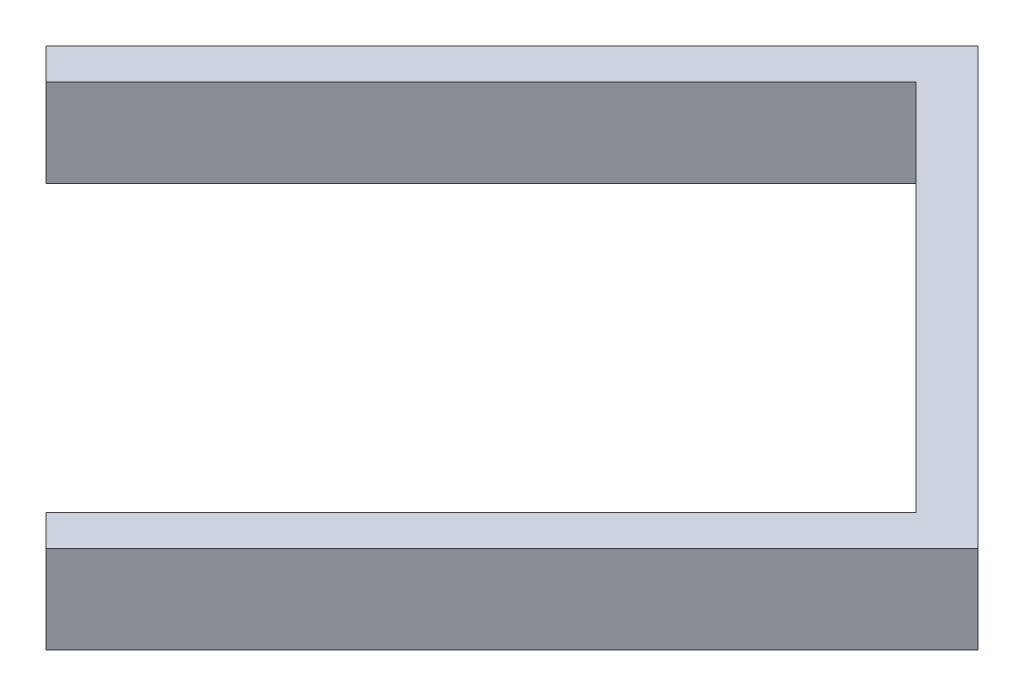
ISO-10303-21;
HEADER;
FILE_DESCRIPTION(('STEP AP214'),'2;1');
FILE_NAME('part.step','',(''),(''),'','','');
FILE_SCHEMA(('AUTOMOTIVE_DESIGN { 1 0 10303 214 1 1 1 1 }'));
ENDSEC;
DATA;
#1=APPLICATION_CONTEXT('core data for automotive mechanical design processes');
#2=APPLICATION_PROTOCOL_DEFINITION('international standard','automotive_design',2000,#1);
#3=PRODUCT_CONTEXT('',#1,'mechanical');
#4=PRODUCT('Part','Part','',(#3));
#5=PRODUCT_RELATED_PRODUCT_CATEGORY('part','',(#4));
#6=PRODUCT_DEFINITION_FORMATION('','',#4);
#7=PRODUCT_DEFINITION_CONTEXT('part definition',#1,'design');
#8=PRODUCT_DEFINITION('design','',#6,#7);
#9=PRODUCT_DEFINITION_SHAPE('','',#8);
#10=(LENGTH_UNIT() NAMED_UNIT(*) SI_UNIT(.MILLI.,.METRE.));
#11=(NAMED_UNIT(*) PLANE_ANGLE_UNIT() SI_UNIT($,.RADIAN.));
#12=(NAMED_UNIT(*) SI_UNIT($,.STERADIAN.) SOLID_ANGLE_UNIT());
#13=UNCERTAINTY_MEASURE_WITH_UNIT(LENGTH_MEASURE(1.E-05),#10,'distance_accuracy_value','');
#14=(GEOMETRIC_REPRESENTATION_CONTEXT(3) GLOBAL_UNCERTAINTY_ASSIGNED_CONTEXT((#13)) GLOBAL_UNIT_ASSIGNED_CONTEXT((#10,
#11,#12)) REPRESENTATION_CONTEXT('',''));
#15=CARTESIAN_POINT('',(0.,0.,0.));
#16=DIRECTION('',(0.,0.,1.));
#17=DIRECTION('',(1.,0.,0.));
#18=AXIS2_PLACEMENT_3D('',#15,#16,#17);
#19=CARTESIAN_POINT('',(-108.053527883218,50.8,-108.053527883218));
#20=DIRECTION('',(0.707106781186548,0.,0.707106781186547));
#21=DIRECTION('',(0.707106781186547,0.,-0.707106781186548));
#22=AXIS2_PLACEMENT_3D('',#19,#20,#21);
#23=PLANE('',#22);
#24=DIRECTION('',(-0.707106781186547,0.,0.707106781186548));
#25=VECTOR('',#24,1.);
#26=CARTESIAN_POINT('',(-108.053527883218,0.,-108.053527883218));
#27=LINE('',#26,#25);
#28=CARTESIAN_POINT('',(11.3038915641731,0.,-227.410947330609));
#29=VERTEX_POINT('',#28);
#30=CARTESIAN_POINT('',(-240.143279825763,0.,24.0362240593278));
#31=VERTEX_POINT('',#30);
#32=EDGE_CURVE('E142',#29,#31,#27,.T.);
#33=ORIENTED_EDGE('',*,*,#32,.F.);
#34=DIRECTION('',(0.,-1.,0.));
#35=VECTOR('',#34,1.);
#36=CARTESIAN_POINT('',(11.3038915641731,50.8,-227.410947330609));
#37=LINE('',#36,#35);
#38=CARTESIAN_POINT('',(11.3038915641731,50.8,-227.410947330609));
#39=VERTEX_POINT('',#38);
#40=EDGE_CURVE('E11',#39,#29,#37,.T.);
#41=ORIENTED_EDGE('',*,*,#40,.F.);
#42=DIRECTION('',(-0.707106781186547,0.,0.707106781186548));
#43=VECTOR('',#42,1.);
#44=CARTESIAN_POINT('',(-108.053527883218,50.8,-108.053527883218));
#45=LINE('',#44,#43);
#46=CARTESIAN_POINT('',(-240.143279825763,50.8,24.0362240593278));
#47=VERTEX_POINT('',#46);
#48=EDGE_CURVE('E171',#39,#47,#45,.T.);
#49=ORIENTED_EDGE('',*,*,#48,.T.);
#50=DIRECTION('',(0.,-1.,0.));
#51=VECTOR('',#50,1.);
#52=CARTESIAN_POINT('',(-240.143279825763,50.8,24.0362240593278));
#53=LINE('',#52,#51);
#54=EDGE_CURVE('E61',#47,#31,#53,.T.);
#55=ORIENTED_EDGE('',*,*,#54,.T.);
#56=EDGE_LOOP('',(#33,#41,#49,#55));
#57=FACE_BOUND('',#56,.T.);
#58=ADVANCED_FACE('F44',(#57),#23,.T.);
#59=CARTESIAN_POINT('',(119.357419447391,50.8,-119.357419447391));
#60=DIRECTION('',(-0.707106781186547,0.,0.707106781186548));
#61=DIRECTION('',(0.707106781186548,0.,0.707106781186547));
#62=AXIS2_PLACEMENT_3D('',#59,#60,#61);
#63=PLANE('',#62);
#64=CARTESIAN_POINT('',(119.357419447391,25.4,-119.357419447391));
#65=DIRECTION('',(-0.707106781186547,0.,0.707106781186548));
#66=DIRECTION('',(0.707106781186548,0.,0.707106781186547));
#67=AXIS2_PLACEMENT_3D('',#64,#65,#66);
#68=CIRCLE('',#67,6.35000000000003);
#69=CARTESIAN_POINT('',(114.867291386856,25.4,-123.847547507925));
#70=VERTEX_POINT('',#69);
#71=EDGE_CURVE('E146',#70,#70,#68,.T.);
#72=ORIENTED_EDGE('',*,*,#71,.F.);
#73=EDGE_LOOP('',(#72));
#74=FACE_BOUND('',#73,.T.);
#75=DIRECTION('',(-0.707106781186548,0.,-0.707106781186547));
#76=VECTOR('',#75,1.);
#77=CARTESIAN_POINT('',(119.357419447391,0.,-119.357419447391));
#78=LINE('',#77,#76);
#79=CARTESIAN_POINT('',(226.830038469833,0.,-11.884800424949));
#80=VERTEX_POINT('',#79);
#81=EDGE_CURVE('E145',#80,#29,#78,.T.);
#82=ORIENTED_EDGE('',*,*,#81,.F.);
#83=DIRECTION('',(0.,-1.,0.));
#84=VECTOR('',#83,1.);
#85=CARTESIAN_POINT('',(226.830038469833,50.8,-11.884800424949));
#86=LINE('',#85,#84);
#87=CARTESIAN_POINT('',(226.830038469833,50.8,-11.884800424949));
#88=VERTEX_POINT('',#87);
#89=EDGE_CURVE('E53',#88,#80,#86,.T.);
#90=ORIENTED_EDGE('',*,*,#89,.F.);
#91=DIRECTION('',(-0.707106781186548,0.,-0.707106781186547));
#92=VECTOR('',#91,1.);
#93=CARTESIAN_POINT('',(119.357419447391,50.8,-119.357419447391));
#94=LINE('',#93,#92);
#95=EDGE_CURVE('E203',#88,#39,#94,.T.);
#96=ORIENTED_EDGE('',*,*,#95,.T.);
#97=ORIENTED_EDGE('',*,*,#40,.T.);
#98=EDGE_LOOP('',(#82,#90,#96,#97));
#99=FACE_BOUND('',#98,.T.);
#100=ADVANCED_FACE('F194',(#74,#99),#63,.T.);
#101=CARTESIAN_POINT('',(107.472619022442,50.8,107.472619022442));
#102=DIRECTION('',(-0.707106781186547,0.,-0.707106781186548));
#103=DIRECTION('',(-0.707106781186548,0.,0.707106781186547));
#104=AXIS2_PLACEMENT_3D('',#101,#102,#103);
#105=PLANE('',#104);
#106=DIRECTION('',(0.707106781186548,0.,-0.707106781186547));
#107=VECTOR('',#106,1.);
#108=CARTESIAN_POINT('',(107.472619022442,0.,107.472619022442));
#109=LINE('',#108,#107);
#110=CARTESIAN_POINT('',(-24.6171329201035,0.,239.562370964987));
#111=VERTEX_POINT('',#110);
#112=EDGE_CURVE('E150',#111,#80,#109,.T.);
#113=ORIENTED_EDGE('',*,*,#112,.F.);
#114=DIRECTION('',(0.,-1.,0.));
#115=VECTOR('',#114,1.);
#116=CARTESIAN_POINT('',(-24.6171329201035,50.8,239.562370964987));
#117=LINE('',#116,#115);
#118=CARTESIAN_POINT('',(-24.6171329201035,50.8,239.562370964987));
#119=VERTEX_POINT('',#118);
#120=EDGE_CURVE('E181',#119,#111,#117,.T.);
#121=ORIENTED_EDGE('',*,*,#120,.F.);
#122=DIRECTION('',(0.707106781186548,0.,-0.707106781186547));
#123=VECTOR('',#122,1.);
#124=CARTESIAN_POINT('',(107.472619022442,50.8,107.472619022442));
#125=LINE('',#124,#123);
#126=EDGE_CURVE('E190',#119,#88,#125,.T.);
#127=ORIENTED_EDGE('',*,*,#126,.T.);
#128=ORIENTED_EDGE('',*,*,#89,.T.);
#129=EDGE_LOOP('',(#113,#121,#127,#128));
#130=FACE_BOUND('',#129,.T.);
#131=ADVANCED_FACE('F188',(#130),#105,.T.);
#132=CARTESIAN_POINT('',(-132.089751942545,50.8,132.089751942545));
#133=DIRECTION('',(-0.707106781186548,0.,0.707106781186548));
#134=DIRECTION('',(0.707106781186548,0.,0.707106781186548));
#135=AXIS2_PLACEMENT_3D('',#132,#133,#134);
#136=PLANE('',#135);
#137=DIRECTION('',(-0.707106781186548,0.,-0.707106781186548));
#138=VECTOR('',#137,1.);
#139=CARTESIAN_POINT('',(-132.089751942545,0.,132.089751942545));
#140=LINE('',#139,#138);
#141=CARTESIAN_POINT('',(-6.65662067796521,0.,257.522883207125));
#142=VERTEX_POINT('',#141);
#143=EDGE_CURVE('E154',#142,#111,#140,.T.);
#144=ORIENTED_EDGE('',*,*,#143,.F.);
#145=DIRECTION('',(0.,-1.,0.));
#146=VECTOR('',#145,1.);
#147=CARTESIAN_POINT('',(-6.65662067796521,50.8,257.522883207125));
#148=LINE('',#147,#146);
#149=CARTESIAN_POINT('',(-6.65662067796521,50.8,257.522883207125));
#150=VERTEX_POINT('',#149);
#151=EDGE_CURVE('E178',#150,#142,#148,.T.);
#152=ORIENTED_EDGE('',*,*,#151,.F.);
#153=DIRECTION('',(-0.707106781186548,0.,-0.707106781186548));
#154=VECTOR('',#153,1.);
#155=CARTESIAN_POINT('',(-132.089751942545,50.8,132.089751942545));
#156=LINE('',#155,#154);
#157=EDGE_CURVE('E202',#150,#119,#156,.T.);
#158=ORIENTED_EDGE('',*,*,#157,.T.);
#159=ORIENTED_EDGE('',*,*,#120,.T.);
#160=EDGE_LOOP('',(#144,#152,#158,#159));
#161=FACE_BOUND('',#160,.T.);
#162=ADVANCED_FACE('F200',(#161),#136,.T.);
#163=CARTESIAN_POINT('',(125.43313126458,50.8,125.43313126458));
#164=DIRECTION('',(0.707106781186548,0.,0.707106781186548));
#165=DIRECTION('',(0.707106781186548,0.,-0.707106781186548));
#166=AXIS2_PLACEMENT_3D('',#163,#164,#165);
#167=PLANE('',#166);
#168=DIRECTION('',(-0.707106781186548,0.,0.707106781186548));
#169=VECTOR('',#168,1.);
#170=CARTESIAN_POINT('',(125.43313126458,0.,125.43313126458));
#171=LINE('',#170,#169);
#172=CARTESIAN_POINT('',(262.751062954109,0.,-11.8848004249491));
#173=VERTEX_POINT('',#172);
#174=EDGE_CURVE('E158',#173,#142,#171,.T.);
#175=ORIENTED_EDGE('',*,*,#174,.F.);
#176=DIRECTION('',(0.,-1.,0.));
#177=VECTOR('',#176,1.);
#178=CARTESIAN_POINT('',(262.751062954109,50.8,-11.8848004249491));
#179=LINE('',#178,#177);
#180=CARTESIAN_POINT('',(262.751062954109,50.8,-11.8848004249491));
#181=VERTEX_POINT('',#180);
#182=EDGE_CURVE('E121',#181,#173,#179,.T.);
#183=ORIENTED_EDGE('',*,*,#182,.F.);
#184=DIRECTION('',(-0.707106781186548,0.,0.707106781186548));
#185=VECTOR('',#184,1.);
#186=CARTESIAN_POINT('',(125.43313126458,50.8,125.43313126458));
#187=LINE('',#186,#185);
#188=EDGE_CURVE('E131',#181,#150,#187,.T.);
#189=ORIENTED_EDGE('',*,*,#188,.T.);
#190=ORIENTED_EDGE('',*,*,#151,.T.);
#191=EDGE_LOOP('',(#175,#183,#189,#190));
#192=FACE_BOUND('',#191,.T.);
#193=ADVANCED_FACE('F213',(#192),#167,.T.);
#194=CARTESIAN_POINT('',(137.317931689529,50.8,-137.317931689529));
#195=DIRECTION('',(0.707106781186548,0.,-0.707106781186548));
#196=DIRECTION('',(-0.707106781186548,0.,-0.707106781186548));
#197=AXIS2_PLACEMENT_3D('',#194,#195,#196);
#198=PLANE('',#197);
#199=CARTESIAN_POINT('',(137.317931689529,25.4,-137.317931689529));
#200=DIRECTION('',(0.707106781186548,0.,-0.707106781186547));
#201=DIRECTION('',(-0.707106781186547,0.,-0.707106781186548));
#202=AXIS2_PLACEMENT_3D('',#199,#200,#201);
#203=CIRCLE('',#202,6.35000000000003);
#204=CARTESIAN_POINT('',(132.827803628995,25.4,-141.808059750064));
#205=VERTEX_POINT('',#204);
#206=EDGE_CURVE('E247',#205,#205,#203,.T.);
#207=ORIENTED_EDGE('',*,*,#206,.F.);
#208=EDGE_LOOP('',(#207));
#209=FACE_BOUND('',#208,.T.);
#210=DIRECTION('',(0.707106781186548,0.,0.707106781186548));
#211=VECTOR('',#210,1.);
#212=CARTESIAN_POINT('',(137.317931689529,0.,-137.317931689529));
#213=LINE('',#212,#211);
#214=CARTESIAN_POINT('',(11.303891564173,0.,-263.331971814885));
#215=VERTEX_POINT('',#214);
#216=EDGE_CURVE('E116',#215,#173,#213,.T.);
#217=ORIENTED_EDGE('',*,*,#216,.F.);
#218=DIRECTION('',(0.,-1.,0.));
#219=VECTOR('',#218,1.);
#220=CARTESIAN_POINT('',(11.303891564173,50.8,-263.331971814885));
#221=LINE('',#220,#219);
#222=CARTESIAN_POINT('',(11.303891564173,50.8,-263.331971814885));
#223=VERTEX_POINT('',#222);
#224=EDGE_CURVE('E111',#223,#215,#221,.T.);
#225=ORIENTED_EDGE('',*,*,#224,.F.);
#226=DIRECTION('',(0.707106781186548,0.,0.707106781186548));
#227=VECTOR('',#226,1.);
#228=CARTESIAN_POINT('',(137.317931689529,50.8,-137.317931689529));
#229=LINE('',#228,#227);
#230=EDGE_CURVE('E114',#223,#181,#229,.T.);
#231=ORIENTED_EDGE('',*,*,#230,.T.);
#232=ORIENTED_EDGE('',*,*,#182,.T.);
#233=EDGE_LOOP('',(#217,#225,#231,#232));
#234=FACE_BOUND('',#233,.T.);
#235=ADVANCED_FACE('F113',(#209,#234),#198,.T.);
#236=CARTESIAN_POINT('',(-126.014040125356,50.8,-126.014040125356));
#237=DIRECTION('',(-0.707106781186548,0.,-0.707106781186547));
#238=DIRECTION('',(-0.707106781186547,0.,0.707106781186548));
#239=AXIS2_PLACEMENT_3D('',#236,#237,#238);
#240=PLANE('',#239);
#241=DIRECTION('',(0.707106781186547,0.,-0.707106781186548));
#242=VECTOR('',#241,1.);
#243=CARTESIAN_POINT('',(-126.014040125356,0.,-126.014040125356));
#244=LINE('',#243,#242);
#245=CARTESIAN_POINT('',(-258.103792067901,0.,6.07571181718949));
#246=VERTEX_POINT('',#245);
#247=EDGE_CURVE('E164',#246,#215,#244,.T.);
#248=ORIENTED_EDGE('',*,*,#247,.F.);
#249=DIRECTION('',(0.,-1.,0.));
#250=VECTOR('',#249,1.);
#251=CARTESIAN_POINT('',(-258.103792067901,50.8,6.07571181718949));
#252=LINE('',#251,#250);
#253=CARTESIAN_POINT('',(-258.103792067901,50.8,6.07571181718949));
#254=VERTEX_POINT('',#253);
#255=EDGE_CURVE('E86',#254,#246,#252,.T.);
#256=ORIENTED_EDGE('',*,*,#255,.F.);
#257=DIRECTION('',(0.707106781186547,0.,-0.707106781186548));
#258=VECTOR('',#257,1.);
#259=CARTESIAN_POINT('',(-126.014040125356,50.8,-126.014040125356));
#260=LINE('',#259,#258);
#261=EDGE_CURVE('E128',#254,#223,#260,.T.);
#262=ORIENTED_EDGE('',*,*,#261,.T.);
#263=ORIENTED_EDGE('',*,*,#224,.T.);
#264=EDGE_LOOP('',(#248,#256,#262,#263));
#265=FACE_BOUND('',#264,.T.);
#266=ADVANCED_FACE('F134',(#265),#240,.T.);
#267=CARTESIAN_POINT('',(-132.089751942545,50.8,132.089751942545));
#268=DIRECTION('',(-0.707106781186548,0.,0.707106781186548));
#269=DIRECTION('',(0.707106781186548,0.,0.707106781186548));
#270=AXIS2_PLACEMENT_3D('',#267,#268,#269);
#271=PLANE('',#270);
#272=DIRECTION('',(-0.707106781186548,0.,-0.707106781186548));
#273=VECTOR('',#272,1.);
#274=CARTESIAN_POINT('',(-132.089751942545,0.,132.089751942545));
#275=LINE('',#274,#273);
#276=EDGE_CURVE('E167',#31,#246,#275,.T.);
#277=ORIENTED_EDGE('',*,*,#276,.F.);
#278=ORIENTED_EDGE('',*,*,#54,.F.);
#279=DIRECTION('',(-0.707106781186548,0.,-0.707106781186548));
#280=VECTOR('',#279,1.);
#281=CARTESIAN_POINT('',(-132.089751942545,50.8,132.089751942545));
#282=LINE('',#281,#280);
#283=EDGE_CURVE('E136',#47,#254,#282,.T.);
#284=ORIENTED_EDGE('',*,*,#283,.T.);
#285=ORIENTED_EDGE('',*,*,#255,.T.);
#286=EDGE_LOOP('',(#277,#278,#284,#285));
#287=FACE_BOUND('',#286,.T.);
#288=ADVANCED_FACE('F214',(#287),#271,.T.);
#289=CARTESIAN_POINT('',(0.,50.8,0.));
#290=DIRECTION('',(0.,1.,0.));
#291=DIRECTION('',(0.,0.,1.));
#292=AXIS2_PLACEMENT_3D('',#289,#290,#291);
#293=PLANE('',#292);
#294=ORIENTED_EDGE('',*,*,#48,.F.);
#295=ORIENTED_EDGE('',*,*,#95,.F.);
#296=ORIENTED_EDGE('',*,*,#126,.F.);
#297=ORIENTED_EDGE('',*,*,#157,.F.);
#298=ORIENTED_EDGE('',*,*,#188,.F.);
#299=ORIENTED_EDGE('',*,*,#230,.F.);
#300=ORIENTED_EDGE('',*,*,#261,.F.);
#301=ORIENTED_EDGE('',*,*,#283,.F.);
#302=EDGE_LOOP('',(#294,#295,#296,#297,#298,#299,#300,#301));
#303=FACE_BOUND('',#302,.T.);
#304=ADVANCED_FACE('F126',(#303),#293,.T.);
#305=CARTESIAN_POINT('',(0.,0.,0.));
#306=DIRECTION('',(0.,1.,0.));
#307=DIRECTION('',(0.,0.,1.));
#308=AXIS2_PLACEMENT_3D('',#305,#306,#307);
#309=PLANE('',#308);
#310=ORIENTED_EDGE('',*,*,#32,.T.);
#311=ORIENTED_EDGE('',*,*,#276,.T.);
#312=ORIENTED_EDGE('',*,*,#247,.T.);
#313=ORIENTED_EDGE('',*,*,#216,.T.);
#314=ORIENTED_EDGE('',*,*,#174,.T.);
#315=ORIENTED_EDGE('',*,*,#143,.T.);
#316=ORIENTED_EDGE('',*,*,#112,.T.);
#317=ORIENTED_EDGE('',*,*,#81,.T.);
#318=EDGE_LOOP('',(#310,#311,#312,#313,#314,#315,#316,#317));
#319=FACE_BOUND('',#318,.T.);
#320=ADVANCED_FACE('F196',(#319),#309,.F.);
#321=CARTESIAN_POINT('',(101.396907205253,25.4,-101.396907205253));
#322=DIRECTION('',(0.707106781186548,0.,-0.707106781186547));
#323=DIRECTION('',(-0.707106781186547,0.,-0.707106781186548));
#324=AXIS2_PLACEMENT_3D('',#321,#322,#323);
#325=CYLINDRICAL_SURFACE('',#324,6.35000000000003);
#326=CARTESIAN_POINT('',(114.867291386856,25.4,-123.847547507925));
#327=CARTESIAN_POINT('',(115.054380056045,25.4,-124.034636177114));
#328=CARTESIAN_POINT('',(115.241468725234,25.4,-124.221724846303));
#329=CARTESIAN_POINT('',(115.615646063612,25.4,-124.595902184681));
#330=CARTESIAN_POINT('',(115.802734732801,25.4,-124.78299085387));
#331=CARTESIAN_POINT('',(116.176912071179,25.4,-125.157168192248));
#332=CARTESIAN_POINT('',(116.364000740368,25.4,-125.344256861437));
#333=CARTESIAN_POINT('',(116.738178078746,25.4,-125.718434199815));
#334=CARTESIAN_POINT('',(116.925266747935,25.4,-125.905522869004));
#335=CARTESIAN_POINT('',(117.299444086313,25.4,-126.279700207382));
#336=CARTESIAN_POINT('',(117.486532755501,25.4,-126.466788876571));
#337=CARTESIAN_POINT('',(117.860710093879,25.4,-126.840966214949));
#338=CARTESIAN_POINT('',(118.047798763068,25.4,-127.028054884137));
#339=CARTESIAN_POINT('',(118.421976101446,25.4,-127.402232222515));
#340=CARTESIAN_POINT('',(118.609064770635,25.4,-127.589320891704));
#341=CARTESIAN_POINT('',(118.983242109013,25.4,-127.963498230082));
#342=CARTESIAN_POINT('',(119.170330778202,25.4,-128.150586899271));
#343=CARTESIAN_POINT('',(119.54450811658,25.4,-128.524764237649));
#344=CARTESIAN_POINT('',(119.731596785769,25.4,-128.711852906838));
#345=CARTESIAN_POINT('',(120.105774124147,25.4,-129.086030245216));
#346=CARTESIAN_POINT('',(120.292862793336,25.4,-129.273118914405));
#347=CARTESIAN_POINT('',(120.667040131713,25.4,-129.647296252783));
#348=CARTESIAN_POINT('',(120.854128800902,25.4,-129.834384921972));
#349=CARTESIAN_POINT('',(121.22830613928,25.4,-130.208562260349));
#350=CARTESIAN_POINT('',(121.415394808469,25.4,-130.395650929538));
#351=CARTESIAN_POINT('',(121.789572146847,25.4,-130.769828267916));
#352=CARTESIAN_POINT('',(121.976660816036,25.4,-130.956916937105));
#353=CARTESIAN_POINT('',(122.350838154414,25.4,-131.331094275483));
#354=CARTESIAN_POINT('',(122.537926823603,25.4,-131.518182944672));
#355=CARTESIAN_POINT('',(122.912104161981,25.4,-131.89236028305));
#356=CARTESIAN_POINT('',(123.09919283117,25.4,-132.079448952239));
#357=CARTESIAN_POINT('',(123.473370169548,25.4,-132.453626290617));
#358=CARTESIAN_POINT('',(123.660458838737,25.4,-132.640714959806));
#359=CARTESIAN_POINT('',(124.034636177114,25.4,-133.014892298184));
#360=CARTESIAN_POINT('',(124.221724846303,25.4,-133.201980967373));
#361=CARTESIAN_POINT('',(124.595902184681,25.4,-133.57615830575));
#362=CARTESIAN_POINT('',(124.78299085387,25.4,-133.763246974939));
#363=CARTESIAN_POINT('',(125.157168192248,25.4,-134.137424313317));
#364=CARTESIAN_POINT('',(125.344256861437,25.4,-134.324512982506));
#365=CARTESIAN_POINT('',(125.718434199815,25.4,-134.698690320884));
#366=CARTESIAN_POINT('',(125.905522869004,25.4,-134.885778990073));
#367=CARTESIAN_POINT('',(126.279700207382,25.4,-135.259956328451));
#368=CARTESIAN_POINT('',(126.466788876571,25.4,-135.44704499764));
#369=CARTESIAN_POINT('',(126.840966214949,25.4,-135.821222336018));
#370=CARTESIAN_POINT('',(127.028054884137,25.4,-136.008311005207));
#371=CARTESIAN_POINT('',(127.402232222515,25.4,-136.382488343584));
#372=CARTESIAN_POINT('',(127.589320891704,25.4,-136.569577012773));
#373=CARTESIAN_POINT('',(127.963498230082,25.4,-136.943754351151));
#374=CARTESIAN_POINT('',(128.150586899271,25.4,-137.13084302034));
#375=CARTESIAN_POINT('',(128.524764237649,25.4,-137.505020358718));
#376=CARTESIAN_POINT('',(128.711852906838,25.4,-137.692109027907));
#377=CARTESIAN_POINT('',(129.086030245216,25.4,-138.066286366285));
#378=CARTESIAN_POINT('',(129.273118914405,25.4,-138.253375035474));
#379=CARTESIAN_POINT('',(129.647296252783,25.4,-138.627552373852));
#380=CARTESIAN_POINT('',(129.834384921972,25.4,-138.814641043041));
#381=CARTESIAN_POINT('',(130.208562260349,25.4,-139.188818381419));
#382=CARTESIAN_POINT('',(130.395650929538,25.4,-139.375907050608));
#383=CARTESIAN_POINT('',(130.769828267916,25.4,-139.750084388985));
#384=CARTESIAN_POINT('',(130.956916937105,25.4,-139.937173058174));
#385=CARTESIAN_POINT('',(131.331094275483,25.4,-140.311350396552));
#386=CARTESIAN_POINT('',(131.518182944672,25.4,-140.498439065741));
#387=CARTESIAN_POINT('',(131.89236028305,25.4,-140.872616404119));
#388=CARTESIAN_POINT('',(132.079448952239,25.4,-141.059705073308));
#389=CARTESIAN_POINT('',(132.453626290617,25.4,-141.433882411686));
#390=CARTESIAN_POINT('',(132.640714959806,25.4,-141.620971080875));
#391=CARTESIAN_POINT('',(132.827803628995,25.4,-141.808059750064));
#392=B_SPLINE_CURVE_WITH_KNOTS('',3,(#326,#327,#328,#329,#330,#331,#332,#333,#334,#335,#336,
#337,#338,#339,#340,#341,#342,#343,#344,#345,#346,#347,#348,#349,#350,#351,#352,#353,#354,#355,
#356,#357,#358,#359,#360,#361,#362,#363,#364,#365,#366,#367,#368,#369,#370,#371,#372,#373,#374,
#375,#376,#377,#378,#379,#380,#381,#382,#383,#384,#385,#386,#387,#388,#389,#390,#391),
.UNSPECIFIED.,.F.,.F.,(4,2,2,2,2,2,2,2,2,2,2,2,2,2,2,2,2,2,2,2,2,2,2,2,2,2,2,2,2,2,2,2,4),(0.,
0.793750000000007,1.58750000000001,2.38125,3.17499999999999,3.96875,4.7625,5.55624999999999,
6.34999999999999,7.14374999999999,7.93749999999999,8.73124999999998,9.52499999999999,10.31875,
11.1125,11.90625,12.7,13.49375,14.2875,15.08125,15.875,16.66875,17.4624999999999,18.25625,19.05,
19.84375,20.6375,21.43125,22.2249999999999,23.01875,23.8125,24.6062499999999,25.3999999999999),.UNSPECIFIED.);
#393=EDGE_CURVE('BSEAM256',#70,#205,#392,.T.);
#394=ORIENTED_EDGE('',*,*,#71,.T.);
#395=ORIENTED_EDGE('',*,*,#206,.T.);
#396=ORIENTED_EDGE('',*,*,#393,.T.);
#397=ORIENTED_EDGE('',*,*,#393,.F.);
#398=EDGE_LOOP('',(#394,#396,#395,#397));
#399=FACE_BOUND('',#398,.T.);
#400=ADVANCED_FACE('F256',(#399),#325,.F.);
#401=CLOSED_SHELL('',(#58,#100,#131,#162,#193,#235,#266,#288,#304,#320,#400));
#402=MANIFOLD_SOLID_BREP('B2',#401);
#403=ADVANCED_BREP_SHAPE_REPRESENTATION('',(#18,#402),#14);
#404=SHAPE_DEFINITION_REPRESENTATION(#9,#403);
ENDSEC;
END-ISO-10303-21;
